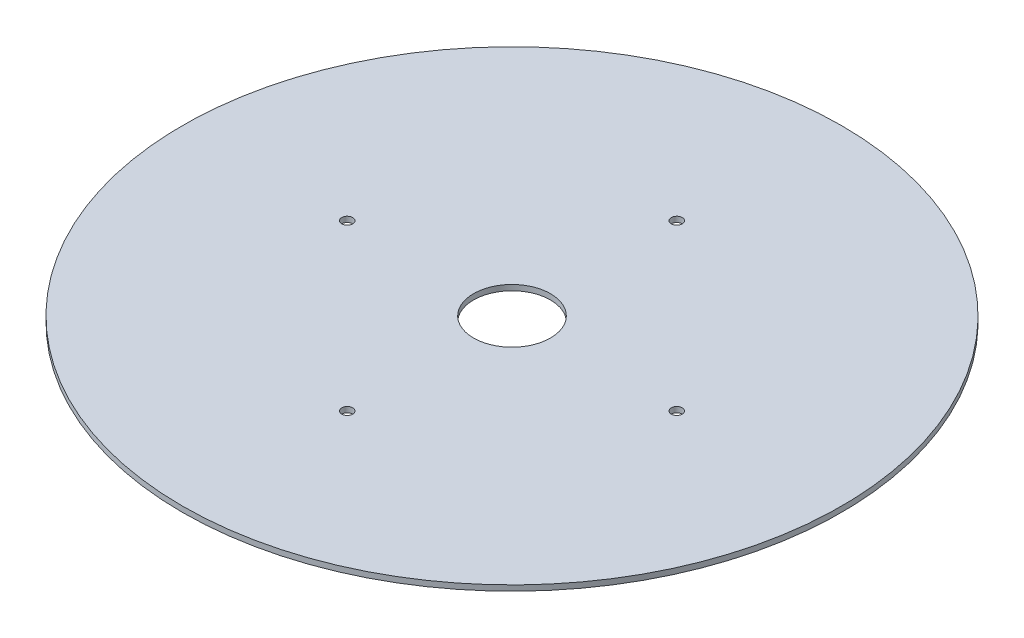
ISO-10303-21;
HEADER;
FILE_DESCRIPTION(('STEP AP214'),'2;1');
FILE_NAME('part.step','',(''),(''),'','','');
FILE_SCHEMA(('AUTOMOTIVE_DESIGN { 1 0 10303 214 1 1 1 1 }'));
ENDSEC;
DATA;
#1=APPLICATION_CONTEXT('core data for automotive mechanical design processes');
#2=APPLICATION_PROTOCOL_DEFINITION('international standard','automotive_design',2000,#1);
#3=PRODUCT_CONTEXT('',#1,'mechanical');
#4=PRODUCT('Part','Part','',(#3));
#5=PRODUCT_RELATED_PRODUCT_CATEGORY('part','',(#4));
#6=PRODUCT_DEFINITION_FORMATION('','',#4);
#7=PRODUCT_DEFINITION_CONTEXT('part definition',#1,'design');
#8=PRODUCT_DEFINITION('design','',#6,#7);
#9=PRODUCT_DEFINITION_SHAPE('','',#8);
#10=(LENGTH_UNIT() NAMED_UNIT(*) SI_UNIT(.MILLI.,.METRE.));
#11=(NAMED_UNIT(*) PLANE_ANGLE_UNIT() SI_UNIT($,.RADIAN.));
#12=(NAMED_UNIT(*) SI_UNIT($,.STERADIAN.) SOLID_ANGLE_UNIT());
#13=UNCERTAINTY_MEASURE_WITH_UNIT(LENGTH_MEASURE(1.E-05),#10,'distance_accuracy_value','');
#14=(GEOMETRIC_REPRESENTATION_CONTEXT(3) GLOBAL_UNCERTAINTY_ASSIGNED_CONTEXT((#13)) GLOBAL_UNIT_ASSIGNED_CONTEXT((#10,
#11,#12)) REPRESENTATION_CONTEXT('',''));
#15=CARTESIAN_POINT('',(0.,0.,0.));
#16=DIRECTION('',(0.,0.,1.));
#17=DIRECTION('',(1.,0.,0.));
#18=AXIS2_PLACEMENT_3D('',#15,#16,#17);
#19=CARTESIAN_POINT('',(0.,2.5,0.));
#20=DIRECTION('',(0.,1.,0.));
#21=DIRECTION('',(0.,0.,1.));
#22=AXIS2_PLACEMENT_3D('',#19,#20,#21);
#23=PLANE('',#22);
#24=CARTESIAN_POINT('',(75.,2.5,5.2372220082647E-13));
#25=DIRECTION('',(0.,1.,0.));
#26=DIRECTION('',(0.,0.,1.));
#27=AXIS2_PLACEMENT_3D('',#24,#25,#26);
#28=CIRCLE('',#27,2.49999999999999);
#29=CARTESIAN_POINT('',(75.,2.5,2.50000000000051));
#30=VERTEX_POINT('',#29);
#31=EDGE_CURVE('E63',#30,#30,#28,.T.);
#32=ORIENTED_EDGE('',*,*,#31,.F.);
#33=EDGE_LOOP('',(#32));
#34=FACE_BOUND('',#33,.T.);
#35=CARTESIAN_POINT('',(-75.,2.5,0.));
#36=DIRECTION('',(0.,1.,0.));
#37=DIRECTION('',(0.,0.,1.));
#38=AXIS2_PLACEMENT_3D('',#35,#36,#37);
#39=CIRCLE('',#38,2.5);
#40=CARTESIAN_POINT('',(-75.,2.5,2.5));
#41=VERTEX_POINT('',#40);
#42=EDGE_CURVE('E51',#41,#41,#39,.T.);
#43=ORIENTED_EDGE('',*,*,#42,.F.);
#44=EDGE_LOOP('',(#43));
#45=FACE_BOUND('',#44,.T.);
#46=CARTESIAN_POINT('',(0.,2.5,0.));
#47=DIRECTION('',(0.,1.,0.));
#48=DIRECTION('',(0.,0.,1.));
#49=AXIS2_PLACEMENT_3D('',#46,#47,#48);
#50=CIRCLE('',#49,150.);
#51=CARTESIAN_POINT('',(0.,2.5,150.));
#52=VERTEX_POINT('',#51);
#53=EDGE_CURVE('E10',#52,#52,#50,.T.);
#54=ORIENTED_EDGE('',*,*,#53,.T.);
#55=EDGE_LOOP('',(#54));
#56=FACE_BOUND('',#55,.T.);
#57=CARTESIAN_POINT('',(0.,2.5,0.));
#58=DIRECTION('',(0.,1.,0.));
#59=DIRECTION('',(0.,0.,1.));
#60=AXIS2_PLACEMENT_3D('',#57,#58,#59);
#61=CIRCLE('',#60,17.5);
#62=CARTESIAN_POINT('',(0.,2.5,17.5));
#63=VERTEX_POINT('',#62);
#64=EDGE_CURVE('E46',#63,#63,#61,.T.);
#65=ORIENTED_EDGE('',*,*,#64,.F.);
#66=EDGE_LOOP('',(#65));
#67=FACE_BOUND('',#66,.T.);
#68=CARTESIAN_POINT('',(2.61861100413235E-13,2.5,-75.));
#69=DIRECTION('',(0.,1.,0.));
#70=DIRECTION('',(0.,0.,1.));
#71=AXIS2_PLACEMENT_3D('',#68,#69,#70);
#72=CIRCLE('',#71,2.49999999999999);
#73=CARTESIAN_POINT('',(2.61861100413235E-13,2.5,-72.5));
#74=VERTEX_POINT('',#73);
#75=EDGE_CURVE('E57',#74,#74,#72,.T.);
#76=ORIENTED_EDGE('',*,*,#75,.F.);
#77=EDGE_LOOP('',(#76));
#78=FACE_BOUND('',#77,.T.);
#79=CARTESIAN_POINT('',(-7.85583301239705E-13,2.5,75.));
#80=DIRECTION('',(0.,1.,0.));
#81=DIRECTION('',(0.,0.,1.));
#82=AXIS2_PLACEMENT_3D('',#79,#80,#81);
#83=CIRCLE('',#82,2.5);
#84=CARTESIAN_POINT('',(-7.85583301239705E-13,2.5,77.5));
#85=VERTEX_POINT('',#84);
#86=EDGE_CURVE('E69',#85,#85,#83,.T.);
#87=ORIENTED_EDGE('',*,*,#86,.F.);
#88=EDGE_LOOP('',(#87));
#89=FACE_BOUND('',#88,.T.);
#90=ADVANCED_FACE('F35',(#34,#45,#56,#67,#78,#89),#23,.T.);
#91=CARTESIAN_POINT('',(0.,0.,0.));
#92=DIRECTION('',(0.,1.,0.));
#93=DIRECTION('',(0.,0.,1.));
#94=AXIS2_PLACEMENT_3D('',#91,#92,#93);
#95=PLANE('',#94);
#96=CARTESIAN_POINT('',(0.,0.,0.));
#97=DIRECTION('',(0.,1.,0.));
#98=DIRECTION('',(0.,0.,1.));
#99=AXIS2_PLACEMENT_3D('',#96,#97,#98);
#100=CIRCLE('',#99,150.);
#101=CARTESIAN_POINT('',(0.,0.,150.));
#102=VERTEX_POINT('',#101);
#103=EDGE_CURVE('E39',#102,#102,#100,.T.);
#104=ORIENTED_EDGE('',*,*,#103,.F.);
#105=EDGE_LOOP('',(#104));
#106=FACE_BOUND('',#105,.T.);
#107=CARTESIAN_POINT('',(0.,0.,0.));
#108=DIRECTION('',(0.,1.,0.));
#109=DIRECTION('',(0.,0.,1.));
#110=AXIS2_PLACEMENT_3D('',#107,#108,#109);
#111=CIRCLE('',#110,17.5);
#112=CARTESIAN_POINT('',(0.,0.,17.5));
#113=VERTEX_POINT('',#112);
#114=EDGE_CURVE('E48',#113,#113,#111,.T.);
#115=ORIENTED_EDGE('',*,*,#114,.T.);
#116=EDGE_LOOP('',(#115));
#117=FACE_BOUND('',#116,.T.);
#118=CARTESIAN_POINT('',(-75.,0.,0.));
#119=DIRECTION('',(0.,1.,0.));
#120=DIRECTION('',(0.,0.,1.));
#121=AXIS2_PLACEMENT_3D('',#118,#119,#120);
#122=CIRCLE('',#121,2.5);
#123=CARTESIAN_POINT('',(-75.,0.,2.5));
#124=VERTEX_POINT('',#123);
#125=EDGE_CURVE('E54',#124,#124,#122,.T.);
#126=ORIENTED_EDGE('',*,*,#125,.T.);
#127=EDGE_LOOP('',(#126));
#128=FACE_BOUND('',#127,.T.);
#129=CARTESIAN_POINT('',(2.61861100413235E-13,0.,-75.));
#130=DIRECTION('',(0.,1.,0.));
#131=DIRECTION('',(0.,0.,1.));
#132=AXIS2_PLACEMENT_3D('',#129,#130,#131);
#133=CIRCLE('',#132,2.49999999999999);
#134=CARTESIAN_POINT('',(2.61861100413235E-13,0.,-72.5));
#135=VERTEX_POINT('',#134);
#136=EDGE_CURVE('E60',#135,#135,#133,.T.);
#137=ORIENTED_EDGE('',*,*,#136,.T.);
#138=EDGE_LOOP('',(#137));
#139=FACE_BOUND('',#138,.T.);
#140=CARTESIAN_POINT('',(75.,0.,5.2372220082647E-13));
#141=DIRECTION('',(0.,1.,0.));
#142=DIRECTION('',(0.,0.,1.));
#143=AXIS2_PLACEMENT_3D('',#140,#141,#142);
#144=CIRCLE('',#143,2.49999999999999);
#145=CARTESIAN_POINT('',(75.,0.,2.50000000000051));
#146=VERTEX_POINT('',#145);
#147=EDGE_CURVE('E66',#146,#146,#144,.T.);
#148=ORIENTED_EDGE('',*,*,#147,.T.);
#149=EDGE_LOOP('',(#148));
#150=FACE_BOUND('',#149,.T.);
#151=CARTESIAN_POINT('',(-7.85583301239705E-13,0.,75.));
#152=DIRECTION('',(0.,1.,0.));
#153=DIRECTION('',(0.,0.,1.));
#154=AXIS2_PLACEMENT_3D('',#151,#152,#153);
#155=CIRCLE('',#154,2.5);
#156=CARTESIAN_POINT('',(-7.85583301239705E-13,0.,77.5));
#157=VERTEX_POINT('',#156);
#158=EDGE_CURVE('E72',#157,#157,#155,.T.);
#159=ORIENTED_EDGE('',*,*,#158,.T.);
#160=EDGE_LOOP('',(#159));
#161=FACE_BOUND('',#160,.T.);
#162=ADVANCED_FACE('F82',(#106,#117,#128,#139,#150,#161),#95,.F.);
#163=CARTESIAN_POINT('',(0.,2.5,0.));
#164=DIRECTION('',(0.,-1.,0.));
#165=DIRECTION('',(0.,0.,-1.));
#166=AXIS2_PLACEMENT_3D('',#163,#164,#165);
#167=CYLINDRICAL_SURFACE('',#166,150.);
#168=ORIENTED_EDGE('',*,*,#53,.F.);
#169=EDGE_LOOP('',(#168));
#170=FACE_BOUND('',#169,.T.);
#171=ORIENTED_EDGE('',*,*,#103,.T.);
#172=EDGE_LOOP('',(#171));
#173=FACE_BOUND('',#172,.T.);
#174=ADVANCED_FACE('F37',(#170,#173),#167,.T.);
#175=CARTESIAN_POINT('',(0.,2.5,0.));
#176=DIRECTION('',(0.,-1.,0.));
#177=DIRECTION('',(0.,0.,-1.));
#178=AXIS2_PLACEMENT_3D('',#175,#176,#177);
#179=CYLINDRICAL_SURFACE('',#178,17.5);
#180=ORIENTED_EDGE('',*,*,#64,.T.);
#181=EDGE_LOOP('',(#180));
#182=FACE_BOUND('',#181,.T.);
#183=ORIENTED_EDGE('',*,*,#114,.F.);
#184=EDGE_LOOP('',(#183));
#185=FACE_BOUND('',#184,.T.);
#186=ADVANCED_FACE('F92',(#182,#185),#179,.F.);
#187=CARTESIAN_POINT('',(-75.,2.5,0.));
#188=DIRECTION('',(0.,-1.,0.));
#189=DIRECTION('',(0.,0.,-1.));
#190=AXIS2_PLACEMENT_3D('',#187,#188,#189);
#191=CYLINDRICAL_SURFACE('',#190,2.5);
#192=ORIENTED_EDGE('',*,*,#42,.T.);
#193=EDGE_LOOP('',(#192));
#194=FACE_BOUND('',#193,.T.);
#195=ORIENTED_EDGE('',*,*,#125,.F.);
#196=EDGE_LOOP('',(#195));
#197=FACE_BOUND('',#196,.T.);
#198=ADVANCED_FACE('F95',(#194,#197),#191,.F.);
#199=CARTESIAN_POINT('',(2.61861100413235E-13,2.5,-75.));
#200=DIRECTION('',(0.,-1.,0.));
#201=DIRECTION('',(0.,0.,-1.));
#202=AXIS2_PLACEMENT_3D('',#199,#200,#201);
#203=CYLINDRICAL_SURFACE('',#202,2.49999999999999);
#204=ORIENTED_EDGE('',*,*,#75,.T.);
#205=EDGE_LOOP('',(#204));
#206=FACE_BOUND('',#205,.T.);
#207=ORIENTED_EDGE('',*,*,#136,.F.);
#208=EDGE_LOOP('',(#207));
#209=FACE_BOUND('',#208,.T.);
#210=ADVANCED_FACE('F99',(#206,#209),#203,.F.);
#211=CARTESIAN_POINT('',(75.,2.5,5.2372220082647E-13));
#212=DIRECTION('',(0.,-1.,0.));
#213=DIRECTION('',(0.,0.,-1.));
#214=AXIS2_PLACEMENT_3D('',#211,#212,#213);
#215=CYLINDRICAL_SURFACE('',#214,2.49999999999999);
#216=ORIENTED_EDGE('',*,*,#31,.T.);
#217=EDGE_LOOP('',(#216));
#218=FACE_BOUND('',#217,.T.);
#219=ORIENTED_EDGE('',*,*,#147,.F.);
#220=EDGE_LOOP('',(#219));
#221=FACE_BOUND('',#220,.T.);
#222=ADVANCED_FACE('F103',(#218,#221),#215,.F.);
#223=CARTESIAN_POINT('',(-7.85583301239705E-13,2.5,75.));
#224=DIRECTION('',(0.,-1.,0.));
#225=DIRECTION('',(0.,0.,-1.));
#226=AXIS2_PLACEMENT_3D('',#223,#224,#225);
#227=CYLINDRICAL_SURFACE('',#226,2.5);
#228=ORIENTED_EDGE('',*,*,#86,.T.);
#229=EDGE_LOOP('',(#228));
#230=FACE_BOUND('',#229,.T.);
#231=ORIENTED_EDGE('',*,*,#158,.F.);
#232=EDGE_LOOP('',(#231));
#233=FACE_BOUND('',#232,.T.);
#234=ADVANCED_FACE('F78',(#230,#233),#227,.F.);
#235=CLOSED_SHELL('',(#90,#162,#174,#186,#198,#210,#222,#234));
#236=MANIFOLD_SOLID_BREP('B2',#235);
#237=ADVANCED_BREP_SHAPE_REPRESENTATION('',(#18,#236),#14);
#238=SHAPE_DEFINITION_REPRESENTATION(#9,#237);
ENDSEC;
END-ISO-10303-21;
